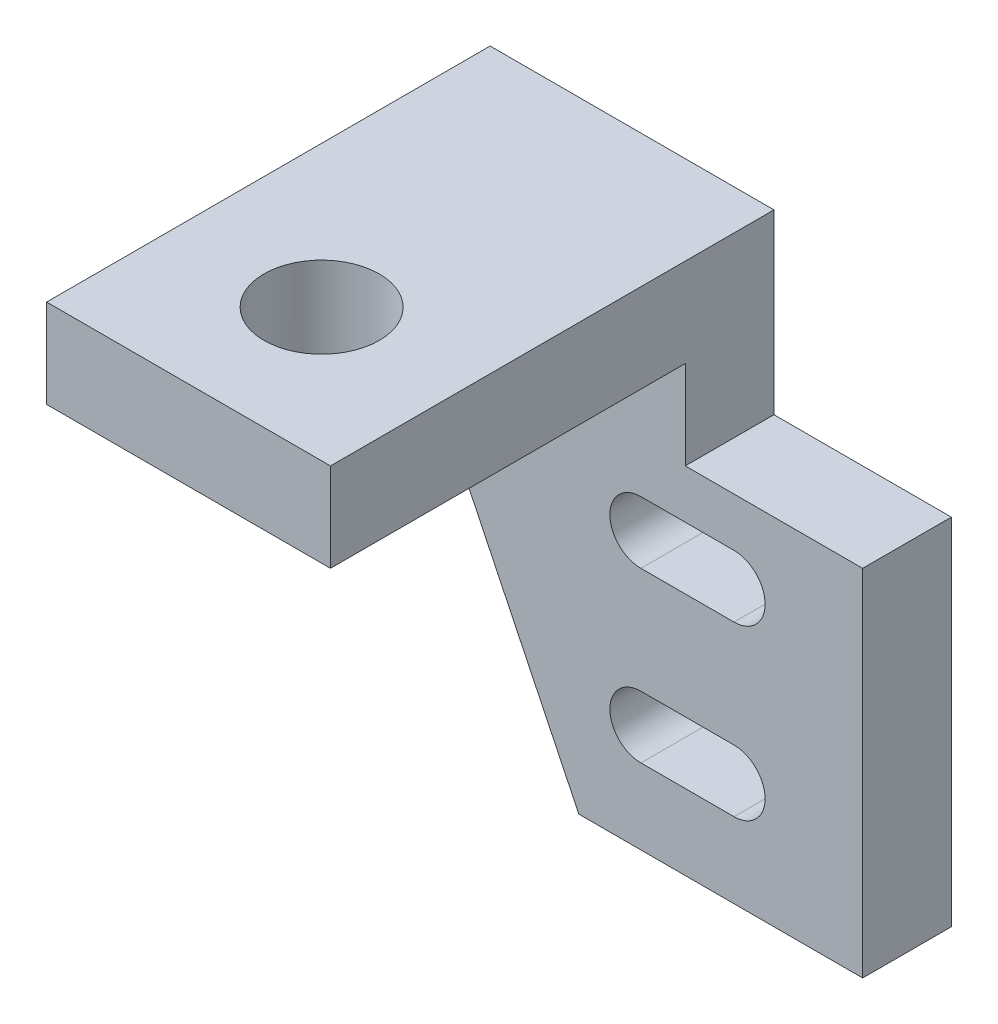
ISO-10303-21;
HEADER;
FILE_DESCRIPTION(('STEP AP214'),'2;1');
FILE_NAME('part.step','',(''),(''),'','','');
FILE_SCHEMA(('AUTOMOTIVE_DESIGN { 1 0 10303 214 1 1 1 1 }'));
ENDSEC;
DATA;
#1=APPLICATION_CONTEXT('core data for automotive mechanical design processes');
#2=APPLICATION_PROTOCOL_DEFINITION('international standard','automotive_design',2000,#1);
#3=PRODUCT_CONTEXT('',#1,'mechanical');
#4=PRODUCT('Part','Part','',(#3));
#5=PRODUCT_RELATED_PRODUCT_CATEGORY('part','',(#4));
#6=PRODUCT_DEFINITION_FORMATION('','',#4);
#7=PRODUCT_DEFINITION_CONTEXT('part definition',#1,'design');
#8=PRODUCT_DEFINITION('design','',#6,#7);
#9=PRODUCT_DEFINITION_SHAPE('','',#8);
#10=(LENGTH_UNIT() NAMED_UNIT(*) SI_UNIT(.MILLI.,.METRE.));
#11=(NAMED_UNIT(*) PLANE_ANGLE_UNIT() SI_UNIT($,.RADIAN.));
#12=(NAMED_UNIT(*) SI_UNIT($,.STERADIAN.) SOLID_ANGLE_UNIT());
#13=UNCERTAINTY_MEASURE_WITH_UNIT(LENGTH_MEASURE(1.E-05),#10,'distance_accuracy_value','');
#14=(GEOMETRIC_REPRESENTATION_CONTEXT(3) GLOBAL_UNCERTAINTY_ASSIGNED_CONTEXT((#13)) GLOBAL_UNIT_ASSIGNED_CONTEXT((#10,
#11,#12)) REPRESENTATION_CONTEXT('',''));
#15=CARTESIAN_POINT('',(0.,0.,0.));
#16=DIRECTION('',(0.,0.,1.));
#17=DIRECTION('',(1.,0.,0.));
#18=AXIS2_PLACEMENT_3D('',#15,#16,#17);
#19=CARTESIAN_POINT('',(0.,0.,5.));
#20=DIRECTION('',(0.,0.,-1.));
#21=DIRECTION('',(-1.,0.,0.));
#22=AXIS2_PLACEMENT_3D('',#19,#20,#21);
#23=PLANE('',#22);
#24=CARTESIAN_POINT('',(2.75,-14.5,5.));
#25=DIRECTION('',(0.,0.,1.));
#26=DIRECTION('',(1.,0.,0.));
#27=AXIS2_PLACEMENT_3D('',#24,#25,#26);
#28=CIRCLE('',#27,1.75);
#29=CARTESIAN_POINT('',(2.75,-16.25,5.));
#30=VERTEX_POINT('',#29);
#31=CARTESIAN_POINT('',(2.75,-12.75,5.));
#32=VERTEX_POINT('',#31);
#33=EDGE_CURVE('E191',#30,#32,#28,.T.);
#34=ORIENTED_EDGE('',*,*,#33,.F.);
#35=DIRECTION('',(1.,0.,0.));
#36=VECTOR('',#35,1.);
#37=CARTESIAN_POINT('',(2.75,-16.25,5.));
#38=LINE('',#37,#36);
#39=CARTESIAN_POINT('',(-2.49999999999999,-16.25,5.));
#40=VERTEX_POINT('',#39);
#41=EDGE_CURVE('E211',#40,#30,#38,.T.);
#42=ORIENTED_EDGE('',*,*,#41,.F.);
#43=CARTESIAN_POINT('',(-2.49999999999999,-14.5,5.));
#44=DIRECTION('',(0.,0.,1.));
#45=DIRECTION('',(1.,0.,0.));
#46=AXIS2_PLACEMENT_3D('',#43,#44,#45);
#47=CIRCLE('',#46,1.75);
#48=CARTESIAN_POINT('',(-2.49999999999999,-12.75,5.));
#49=VERTEX_POINT('',#48);
#50=EDGE_CURVE('E525',#49,#40,#47,.T.);
#51=ORIENTED_EDGE('',*,*,#50,.F.);
#52=DIRECTION('',(-1.,0.,0.));
#53=VECTOR('',#52,1.);
#54=CARTESIAN_POINT('',(2.75,-12.75,5.));
#55=LINE('',#54,#53);
#56=EDGE_CURVE('E524',#32,#49,#55,.T.);
#57=ORIENTED_EDGE('',*,*,#56,.F.);
#58=EDGE_LOOP('',(#34,#42,#51,#57));
#59=FACE_BOUND('',#58,.T.);
#60=CARTESIAN_POINT('',(2.75,-24.,5.));
#61=DIRECTION('',(0.,0.,1.));
#62=DIRECTION('',(1.,0.,0.));
#63=AXIS2_PLACEMENT_3D('',#60,#61,#62);
#64=CIRCLE('',#63,1.75);
#65=CARTESIAN_POINT('',(2.75,-25.75,5.));
#66=VERTEX_POINT('',#65);
#67=CARTESIAN_POINT('',(2.75,-22.25,5.));
#68=VERTEX_POINT('',#67);
#69=EDGE_CURVE('E228',#66,#68,#64,.T.);
#70=ORIENTED_EDGE('',*,*,#69,.F.);
#71=DIRECTION('',(1.,0.,0.));
#72=VECTOR('',#71,1.);
#73=CARTESIAN_POINT('',(2.75,-25.75,5.));
#74=LINE('',#73,#72);
#75=CARTESIAN_POINT('',(-2.49999999999999,-25.75,5.));
#76=VERTEX_POINT('',#75);
#77=EDGE_CURVE('E236',#76,#66,#74,.T.);
#78=ORIENTED_EDGE('',*,*,#77,.F.);
#79=CARTESIAN_POINT('',(-2.49999999999999,-24.,5.));
#80=DIRECTION('',(0.,0.,1.));
#81=DIRECTION('',(1.,0.,0.));
#82=AXIS2_PLACEMENT_3D('',#79,#80,#81);
#83=CIRCLE('',#82,1.75);
#84=CARTESIAN_POINT('',(-2.49999999999999,-22.25,5.));
#85=VERTEX_POINT('',#84);
#86=EDGE_CURVE('E233',#85,#76,#83,.T.);
#87=ORIENTED_EDGE('',*,*,#86,.F.);
#88=DIRECTION('',(-1.,0.,0.));
#89=VECTOR('',#88,1.);
#90=CARTESIAN_POINT('',(2.75,-22.25,5.));
#91=LINE('',#90,#89);
#92=EDGE_CURVE('E230',#68,#85,#91,.T.);
#93=ORIENTED_EDGE('',*,*,#92,.F.);
#94=EDGE_LOOP('',(#70,#78,#87,#93));
#95=FACE_BOUND('',#94,.T.);
#96=DIRECTION('',(1.,0.,0.));
#97=VECTOR('',#96,1.);
#98=CARTESIAN_POINT('',(-16.,-5.,5.));
#99=LINE('',#98,#97);
#100=CARTESIAN_POINT('',(-16.,-5.,5.));
#101=VERTEX_POINT('',#100);
#102=CARTESIAN_POINT('',(0.,-5.,5.));
#103=VERTEX_POINT('',#102);
#104=EDGE_CURVE('E50',#101,#103,#99,.T.);
#105=ORIENTED_EDGE('',*,*,#104,.F.);
#106=DIRECTION('',(0.,-1.,0.));
#107=VECTOR('',#106,1.);
#108=CARTESIAN_POINT('',(-16.,-9.29520131554418,5.));
#109=LINE('',#108,#107);
#110=CARTESIAN_POINT('',(-16.,-9.29520131554418,5.));
#111=VERTEX_POINT('',#110);
#112=EDGE_CURVE('E263',#101,#111,#109,.T.);
#113=ORIENTED_EDGE('',*,*,#112,.T.);
#114=DIRECTION('',(0.43491059789037,-0.900473637505641,0.));
#115=VECTOR('',#114,1.);
#116=CARTESIAN_POINT('',(-5.99999999999999,-30.,5.));
#117=LINE('',#116,#115);
#118=CARTESIAN_POINT('',(-5.99999999999999,-30.,5.));
#119=VERTEX_POINT('',#118);
#120=EDGE_CURVE('E261',#111,#119,#117,.T.);
#121=ORIENTED_EDGE('',*,*,#120,.T.);
#122=DIRECTION('',(1.,0.,0.));
#123=VECTOR('',#122,1.);
#124=CARTESIAN_POINT('',(10.,-30.,5.));
#125=LINE('',#124,#123);
#126=CARTESIAN_POINT('',(10.,-30.,5.));
#127=VERTEX_POINT('',#126);
#128=EDGE_CURVE('E293',#119,#127,#125,.T.);
#129=ORIENTED_EDGE('',*,*,#128,.T.);
#130=DIRECTION('',(0.,1.,0.));
#131=VECTOR('',#130,1.);
#132=CARTESIAN_POINT('',(10.,-9.99999999999999,5.));
#133=LINE('',#132,#131);
#134=CARTESIAN_POINT('',(10.,-9.99999999999999,5.));
#135=VERTEX_POINT('',#134);
#136=EDGE_CURVE('E292',#127,#135,#133,.T.);
#137=ORIENTED_EDGE('',*,*,#136,.T.);
#138=DIRECTION('',(-1.,0.,0.));
#139=VECTOR('',#138,1.);
#140=CARTESIAN_POINT('',(0.,-9.99999999999999,5.));
#141=LINE('',#140,#139);
#142=CARTESIAN_POINT('',(0.,-9.99999999999999,5.));
#143=VERTEX_POINT('',#142);
#144=EDGE_CURVE('E290',#135,#143,#141,.T.);
#145=ORIENTED_EDGE('',*,*,#144,.T.);
#146=DIRECTION('',(0.,1.,0.));
#147=VECTOR('',#146,1.);
#148=CARTESIAN_POINT('',(0.,0.,5.));
#149=LINE('',#148,#147);
#150=EDGE_CURVE('E166',#143,#103,#149,.T.);
#151=ORIENTED_EDGE('',*,*,#150,.T.);
#152=EDGE_LOOP('',(#105,#113,#121,#129,#137,#145,#151));
#153=FACE_BOUND('',#152,.T.);
#154=ADVANCED_FACE('F33',(#59,#95,#153),#23,.F.);
#155=CARTESIAN_POINT('',(0.,0.,0.));
#156=DIRECTION('',(0.,0.,-1.));
#157=DIRECTION('',(-1.,0.,0.));
#158=AXIS2_PLACEMENT_3D('',#155,#156,#157);
#159=PLANE('',#158);
#160=DIRECTION('',(1.,0.,0.));
#161=VECTOR('',#160,1.);
#162=CARTESIAN_POINT('',(2.75,-25.75,0.));
#163=LINE('',#162,#161);
#164=CARTESIAN_POINT('',(-2.49999999999999,-25.75,0.));
#165=VERTEX_POINT('',#164);
#166=CARTESIAN_POINT('',(2.75,-25.75,0.));
#167=VERTEX_POINT('',#166);
#168=EDGE_CURVE('E231',#165,#167,#163,.T.);
#169=ORIENTED_EDGE('',*,*,#168,.T.);
#170=CARTESIAN_POINT('',(2.75,-24.,0.));
#171=DIRECTION('',(0.,0.,1.));
#172=DIRECTION('',(1.,0.,0.));
#173=AXIS2_PLACEMENT_3D('',#170,#171,#172);
#174=CIRCLE('',#173,1.75);
#175=CARTESIAN_POINT('',(2.75,-22.25,0.));
#176=VERTEX_POINT('',#175);
#177=EDGE_CURVE('E227',#167,#176,#174,.T.);
#178=ORIENTED_EDGE('',*,*,#177,.T.);
#179=DIRECTION('',(-1.,0.,0.));
#180=VECTOR('',#179,1.);
#181=CARTESIAN_POINT('',(2.75,-22.25,0.));
#182=LINE('',#181,#180);
#183=CARTESIAN_POINT('',(-2.49999999999999,-22.25,0.));
#184=VERTEX_POINT('',#183);
#185=EDGE_CURVE('E241',#176,#184,#182,.T.);
#186=ORIENTED_EDGE('',*,*,#185,.T.);
#187=CARTESIAN_POINT('',(-2.49999999999999,-24.,0.));
#188=DIRECTION('',(0.,0.,1.));
#189=DIRECTION('',(1.,0.,0.));
#190=AXIS2_PLACEMENT_3D('',#187,#188,#189);
#191=CIRCLE('',#190,1.75);
#192=EDGE_CURVE('E244',#184,#165,#191,.T.);
#193=ORIENTED_EDGE('',*,*,#192,.T.);
#194=EDGE_LOOP('',(#169,#178,#186,#193));
#195=FACE_BOUND('',#194,.T.);
#196=DIRECTION('',(0.,-1.,0.));
#197=VECTOR('',#196,1.);
#198=CARTESIAN_POINT('',(-16.,-9.29520131554418,0.));
#199=LINE('',#198,#197);
#200=CARTESIAN_POINT('',(-16.,0.,0.));
#201=VERTEX_POINT('',#200);
#202=CARTESIAN_POINT('',(-16.,-9.29520131554418,0.));
#203=VERTEX_POINT('',#202);
#204=EDGE_CURVE('E258',#201,#203,#199,.T.);
#205=ORIENTED_EDGE('',*,*,#204,.F.);
#206=DIRECTION('',(-1.,0.,0.));
#207=VECTOR('',#206,1.);
#208=CARTESIAN_POINT('',(-16.,0.,0.));
#209=LINE('',#208,#207);
#210=CARTESIAN_POINT('',(0.,0.,0.));
#211=VERTEX_POINT('',#210);
#212=EDGE_CURVE('E161',#211,#201,#209,.T.);
#213=ORIENTED_EDGE('',*,*,#212,.F.);
#214=DIRECTION('',(0.,1.,0.));
#215=VECTOR('',#214,1.);
#216=CARTESIAN_POINT('',(0.,0.,0.));
#217=LINE('',#216,#215);
#218=CARTESIAN_POINT('',(0.,-9.99999999999999,0.));
#219=VERTEX_POINT('',#218);
#220=EDGE_CURVE('E278',#219,#211,#217,.T.);
#221=ORIENTED_EDGE('',*,*,#220,.F.);
#222=DIRECTION('',(-1.,0.,0.));
#223=VECTOR('',#222,1.);
#224=CARTESIAN_POINT('',(0.,-9.99999999999999,0.));
#225=LINE('',#224,#223);
#226=CARTESIAN_POINT('',(10.,-9.99999999999999,0.));
#227=VERTEX_POINT('',#226);
#228=EDGE_CURVE('E280',#227,#219,#225,.T.);
#229=ORIENTED_EDGE('',*,*,#228,.F.);
#230=DIRECTION('',(0.,1.,0.));
#231=VECTOR('',#230,1.);
#232=CARTESIAN_POINT('',(10.,-9.99999999999999,0.));
#233=LINE('',#232,#231);
#234=CARTESIAN_POINT('',(10.,-30.,0.));
#235=VERTEX_POINT('',#234);
#236=EDGE_CURVE('E282',#235,#227,#233,.T.);
#237=ORIENTED_EDGE('',*,*,#236,.F.);
#238=DIRECTION('',(1.,0.,0.));
#239=VECTOR('',#238,1.);
#240=CARTESIAN_POINT('',(10.,-30.,0.));
#241=LINE('',#240,#239);
#242=CARTESIAN_POINT('',(-5.99999999999999,-30.,0.));
#243=VERTEX_POINT('',#242);
#244=EDGE_CURVE('E284',#243,#235,#241,.T.);
#245=ORIENTED_EDGE('',*,*,#244,.F.);
#246=DIRECTION('',(0.43491059789037,-0.900473637505641,0.));
#247=VECTOR('',#246,1.);
#248=CARTESIAN_POINT('',(-5.99999999999999,-30.,0.));
#249=LINE('',#248,#247);
#250=EDGE_CURVE('E286',#203,#243,#249,.T.);
#251=ORIENTED_EDGE('',*,*,#250,.F.);
#252=EDGE_LOOP('',(#205,#213,#221,#229,#237,#245,#251));
#253=FACE_BOUND('',#252,.T.);
#254=DIRECTION('',(1.,0.,0.));
#255=VECTOR('',#254,1.);
#256=CARTESIAN_POINT('',(2.75,-16.25,0.));
#257=LINE('',#256,#255);
#258=CARTESIAN_POINT('',(-2.49999999999999,-16.25,0.));
#259=VERTEX_POINT('',#258);
#260=CARTESIAN_POINT('',(2.75,-16.25,0.));
#261=VERTEX_POINT('',#260);
#262=EDGE_CURVE('E216',#259,#261,#257,.T.);
#263=ORIENTED_EDGE('',*,*,#262,.T.);
#264=CARTESIAN_POINT('',(2.75,-14.5,0.));
#265=DIRECTION('',(0.,0.,1.));
#266=DIRECTION('',(1.,0.,0.));
#267=AXIS2_PLACEMENT_3D('',#264,#265,#266);
#268=CIRCLE('',#267,1.75);
#269=CARTESIAN_POINT('',(2.75,-12.75,0.));
#270=VERTEX_POINT('',#269);
#271=EDGE_CURVE('E200',#261,#270,#268,.T.);
#272=ORIENTED_EDGE('',*,*,#271,.T.);
#273=DIRECTION('',(-1.,0.,0.));
#274=VECTOR('',#273,1.);
#275=CARTESIAN_POINT('',(2.75,-12.75,0.));
#276=LINE('',#275,#274);
#277=CARTESIAN_POINT('',(-2.49999999999999,-12.75,0.));
#278=VERTEX_POINT('',#277);
#279=EDGE_CURVE('E203',#270,#278,#276,.T.);
#280=ORIENTED_EDGE('',*,*,#279,.T.);
#281=CARTESIAN_POINT('',(-2.49999999999999,-14.5,0.));
#282=DIRECTION('',(0.,0.,1.));
#283=DIRECTION('',(1.,0.,0.));
#284=AXIS2_PLACEMENT_3D('',#281,#282,#283);
#285=CIRCLE('',#284,1.75);
#286=EDGE_CURVE('E208',#278,#259,#285,.T.);
#287=ORIENTED_EDGE('',*,*,#286,.T.);
#288=EDGE_LOOP('',(#263,#272,#280,#287));
#289=FACE_BOUND('',#288,.T.);
#290=ADVANCED_FACE('F334',(#195,#253,#289),#159,.T.);
#291=CARTESIAN_POINT('',(-16.,-9.29520131554418,5.));
#292=DIRECTION('',(1.,0.,0.));
#293=DIRECTION('',(0.,0.,-1.));
#294=AXIS2_PLACEMENT_3D('',#291,#292,#293);
#295=PLANE('',#294);
#296=ORIENTED_EDGE('',*,*,#204,.T.);
#297=DIRECTION('',(0.,0.,-1.));
#298=VECTOR('',#297,1.);
#299=CARTESIAN_POINT('',(-16.,-9.29520131554418,5.));
#300=LINE('',#299,#298);
#301=EDGE_CURVE('E11',#111,#203,#300,.T.);
#302=ORIENTED_EDGE('',*,*,#301,.F.);
#303=ORIENTED_EDGE('',*,*,#112,.F.);
#304=DIRECTION('',(0.,0.,-1.));
#305=VECTOR('',#304,1.);
#306=CARTESIAN_POINT('',(-16.,-5.,25.));
#307=LINE('',#306,#305);
#308=CARTESIAN_POINT('',(-16.,-5.,25.));
#309=VERTEX_POINT('',#308);
#310=EDGE_CURVE('E171',#309,#101,#307,.T.);
#311=ORIENTED_EDGE('',*,*,#310,.F.);
#312=DIRECTION('',(0.,-1.,0.));
#313=VECTOR('',#312,1.);
#314=CARTESIAN_POINT('',(-16.,0.,25.));
#315=LINE('',#314,#313);
#316=CARTESIAN_POINT('',(-16.,0.,25.));
#317=VERTEX_POINT('',#316);
#318=EDGE_CURVE('E169',#317,#309,#315,.T.);
#319=ORIENTED_EDGE('',*,*,#318,.F.);
#320=DIRECTION('',(0.,0.,-1.));
#321=VECTOR('',#320,1.);
#322=CARTESIAN_POINT('',(-16.,0.,5.));
#323=LINE('',#322,#321);
#324=EDGE_CURVE('E154',#317,#201,#323,.T.);
#325=ORIENTED_EDGE('',*,*,#324,.T.);
#326=EDGE_LOOP('',(#296,#302,#303,#311,#319,#325));
#327=FACE_BOUND('',#326,.T.);
#328=ADVANCED_FACE('F35',(#327),#295,.F.);
#329=CARTESIAN_POINT('',(-5.99999999999999,-30.,5.));
#330=DIRECTION('',(0.900473637505641,0.43491059789037,0.));
#331=DIRECTION('',(-0.43491059789037,0.900473637505641,0.));
#332=AXIS2_PLACEMENT_3D('',#329,#330,#331);
#333=PLANE('',#332);
#334=ORIENTED_EDGE('',*,*,#250,.T.);
#335=DIRECTION('',(0.,0.,-1.));
#336=VECTOR('',#335,1.);
#337=CARTESIAN_POINT('',(-5.99999999999999,-30.,5.));
#338=LINE('',#337,#336);
#339=EDGE_CURVE('E42',#119,#243,#338,.T.);
#340=ORIENTED_EDGE('',*,*,#339,.F.);
#341=ORIENTED_EDGE('',*,*,#120,.F.);
#342=ORIENTED_EDGE('',*,*,#301,.T.);
#343=EDGE_LOOP('',(#334,#340,#341,#342));
#344=FACE_BOUND('',#343,.T.);
#345=ADVANCED_FACE('F300',(#344),#333,.F.);
#346=CARTESIAN_POINT('',(10.,-30.,5.));
#347=DIRECTION('',(0.,1.,0.));
#348=DIRECTION('',(-1.,0.,0.));
#349=AXIS2_PLACEMENT_3D('',#346,#347,#348);
#350=PLANE('',#349);
#351=ORIENTED_EDGE('',*,*,#244,.T.);
#352=DIRECTION('',(0.,0.,-1.));
#353=VECTOR('',#352,1.);
#354=CARTESIAN_POINT('',(10.,-30.,5.));
#355=LINE('',#354,#353);
#356=EDGE_CURVE('E267',#127,#235,#355,.T.);
#357=ORIENTED_EDGE('',*,*,#356,.F.);
#358=ORIENTED_EDGE('',*,*,#128,.F.);
#359=ORIENTED_EDGE('',*,*,#339,.T.);
#360=EDGE_LOOP('',(#351,#357,#358,#359));
#361=FACE_BOUND('',#360,.T.);
#362=ADVANCED_FACE('F303',(#361),#350,.F.);
#363=CARTESIAN_POINT('',(10.,-9.99999999999999,5.));
#364=DIRECTION('',(-1.,0.,0.));
#365=DIRECTION('',(0.,-1.,0.));
#366=AXIS2_PLACEMENT_3D('',#363,#364,#365);
#367=PLANE('',#366);
#368=ORIENTED_EDGE('',*,*,#236,.T.);
#369=DIRECTION('',(0.,0.,-1.));
#370=VECTOR('',#369,1.);
#371=CARTESIAN_POINT('',(10.,-9.99999999999999,5.));
#372=LINE('',#371,#370);
#373=EDGE_CURVE('E270',#135,#227,#372,.T.);
#374=ORIENTED_EDGE('',*,*,#373,.F.);
#375=ORIENTED_EDGE('',*,*,#136,.F.);
#376=ORIENTED_EDGE('',*,*,#356,.T.);
#377=EDGE_LOOP('',(#368,#374,#375,#376));
#378=FACE_BOUND('',#377,.T.);
#379=ADVANCED_FACE('F308',(#378),#367,.F.);
#380=CARTESIAN_POINT('',(0.,-9.99999999999999,5.));
#381=DIRECTION('',(0.,-1.,0.));
#382=DIRECTION('',(0.,0.,-1.));
#383=AXIS2_PLACEMENT_3D('',#380,#381,#382);
#384=PLANE('',#383);
#385=ORIENTED_EDGE('',*,*,#228,.T.);
#386=DIRECTION('',(0.,0.,-1.));
#387=VECTOR('',#386,1.);
#388=CARTESIAN_POINT('',(0.,-9.99999999999999,5.));
#389=LINE('',#388,#387);
#390=EDGE_CURVE('E273',#143,#219,#389,.T.);
#391=ORIENTED_EDGE('',*,*,#390,.F.);
#392=ORIENTED_EDGE('',*,*,#144,.F.);
#393=ORIENTED_EDGE('',*,*,#373,.T.);
#394=EDGE_LOOP('',(#385,#391,#392,#393));
#395=FACE_BOUND('',#394,.T.);
#396=ADVANCED_FACE('F313',(#395),#384,.F.);
#397=CARTESIAN_POINT('',(0.,0.,5.));
#398=DIRECTION('',(-1.,0.,0.));
#399=DIRECTION('',(0.,0.,1.));
#400=AXIS2_PLACEMENT_3D('',#397,#398,#399);
#401=PLANE('',#400);
#402=ORIENTED_EDGE('',*,*,#220,.T.);
#403=DIRECTION('',(0.,0.,-1.));
#404=VECTOR('',#403,1.);
#405=CARTESIAN_POINT('',(0.,0.,5.));
#406=LINE('',#405,#404);
#407=CARTESIAN_POINT('',(0.,0.,25.));
#408=VERTEX_POINT('',#407);
#409=EDGE_CURVE('E165',#408,#211,#406,.T.);
#410=ORIENTED_EDGE('',*,*,#409,.F.);
#411=DIRECTION('',(0.,1.,0.));
#412=VECTOR('',#411,1.);
#413=CARTESIAN_POINT('',(0.,-5.,25.));
#414=LINE('',#413,#412);
#415=CARTESIAN_POINT('',(0.,-5.,25.));
#416=VERTEX_POINT('',#415);
#417=EDGE_CURVE('E179',#416,#408,#414,.T.);
#418=ORIENTED_EDGE('',*,*,#417,.F.);
#419=DIRECTION('',(0.,0.,-1.));
#420=VECTOR('',#419,1.);
#421=CARTESIAN_POINT('',(0.,-5.,25.));
#422=LINE('',#421,#420);
#423=EDGE_CURVE('E188',#416,#103,#422,.T.);
#424=ORIENTED_EDGE('',*,*,#423,.T.);
#425=ORIENTED_EDGE('',*,*,#150,.F.);
#426=ORIENTED_EDGE('',*,*,#390,.T.);
#427=EDGE_LOOP('',(#402,#410,#418,#424,#425,#426));
#428=FACE_BOUND('',#427,.T.);
#429=ADVANCED_FACE('F317',(#428),#401,.F.);
#430=CARTESIAN_POINT('',(-16.,0.,5.));
#431=DIRECTION('',(0.,-1.,0.));
#432=DIRECTION('',(0.,0.,-1.));
#433=AXIS2_PLACEMENT_3D('',#430,#431,#432);
#434=PLANE('',#433);
#435=CARTESIAN_POINT('',(-8.,0.,17.5));
#436=DIRECTION('',(0.,-1.,0.));
#437=DIRECTION('',(0.,0.,-1.));
#438=AXIS2_PLACEMENT_3D('',#435,#436,#437);
#439=CIRCLE('',#438,3.25);
#440=CARTESIAN_POINT('',(-8.,0.,14.25));
#441=VERTEX_POINT('',#440);
#442=EDGE_CURVE('E181',#441,#441,#439,.F.);
#443=ORIENTED_EDGE('',*,*,#442,.F.);
#444=EDGE_LOOP('',(#443));
#445=FACE_BOUND('',#444,.T.);
#446=ORIENTED_EDGE('',*,*,#212,.T.);
#447=ORIENTED_EDGE('',*,*,#324,.F.);
#448=DIRECTION('',(-1.,0.,0.));
#449=VECTOR('',#448,1.);
#450=CARTESIAN_POINT('',(0.,0.,25.));
#451=LINE('',#450,#449);
#452=EDGE_CURVE('E159',#408,#317,#451,.T.);
#453=ORIENTED_EDGE('',*,*,#452,.F.);
#454=ORIENTED_EDGE('',*,*,#409,.T.);
#455=EDGE_LOOP('',(#446,#447,#453,#454));
#456=FACE_BOUND('',#455,.T.);
#457=ADVANCED_FACE('F156',(#445,#456),#434,.F.);
#458=CARTESIAN_POINT('',(2.75,-24.,5.));
#459=DIRECTION('',(0.,0.,-1.));
#460=DIRECTION('',(-1.,0.,0.));
#461=AXIS2_PLACEMENT_3D('',#458,#459,#460);
#462=CYLINDRICAL_SURFACE('',#461,1.75);
#463=ORIENTED_EDGE('',*,*,#177,.F.);
#464=DIRECTION('',(0.,0.,-1.));
#465=VECTOR('',#464,1.);
#466=CARTESIAN_POINT('',(2.75,-25.75,5.));
#467=LINE('',#466,#465);
#468=EDGE_CURVE('E238',#66,#167,#467,.T.);
#469=ORIENTED_EDGE('',*,*,#468,.F.);
#470=ORIENTED_EDGE('',*,*,#69,.T.);
#471=DIRECTION('',(0.,0.,-1.));
#472=VECTOR('',#471,1.);
#473=CARTESIAN_POINT('',(2.75,-22.25,5.));
#474=LINE('',#473,#472);
#475=EDGE_CURVE('E255',#68,#176,#474,.T.);
#476=ORIENTED_EDGE('',*,*,#475,.T.);
#477=EDGE_LOOP('',(#463,#469,#470,#476));
#478=FACE_BOUND('',#477,.T.);
#479=ADVANCED_FACE('F345',(#478),#462,.F.);
#480=CARTESIAN_POINT('',(2.75,-22.25,5.));
#481=DIRECTION('',(0.,-1.,0.));
#482=DIRECTION('',(0.,0.,-1.));
#483=AXIS2_PLACEMENT_3D('',#480,#481,#482);
#484=PLANE('',#483);
#485=ORIENTED_EDGE('',*,*,#185,.F.);
#486=ORIENTED_EDGE('',*,*,#475,.F.);
#487=ORIENTED_EDGE('',*,*,#92,.T.);
#488=DIRECTION('',(0.,0.,-1.));
#489=VECTOR('',#488,1.);
#490=CARTESIAN_POINT('',(-2.49999999999999,-22.25,5.));
#491=LINE('',#490,#489);
#492=EDGE_CURVE('E253',#85,#184,#491,.T.);
#493=ORIENTED_EDGE('',*,*,#492,.T.);
#494=EDGE_LOOP('',(#485,#486,#487,#493));
#495=FACE_BOUND('',#494,.T.);
#496=ADVANCED_FACE('F402',(#495),#484,.T.);
#497=CARTESIAN_POINT('',(-2.49999999999999,-24.,5.));
#498=DIRECTION('',(0.,0.,-1.));
#499=DIRECTION('',(-1.,0.,0.));
#500=AXIS2_PLACEMENT_3D('',#497,#498,#499);
#501=CYLINDRICAL_SURFACE('',#500,1.75);
#502=ORIENTED_EDGE('',*,*,#192,.F.);
#503=ORIENTED_EDGE('',*,*,#492,.F.);
#504=ORIENTED_EDGE('',*,*,#86,.T.);
#505=DIRECTION('',(0.,0.,-1.));
#506=VECTOR('',#505,1.);
#507=CARTESIAN_POINT('',(-2.49999999999999,-25.75,5.));
#508=LINE('',#507,#506);
#509=EDGE_CURVE('E251',#76,#165,#508,.T.);
#510=ORIENTED_EDGE('',*,*,#509,.T.);
#511=EDGE_LOOP('',(#502,#503,#504,#510));
#512=FACE_BOUND('',#511,.T.);
#513=ADVANCED_FACE('F412',(#512),#501,.F.);
#514=CARTESIAN_POINT('',(2.75,-25.75,5.));
#515=DIRECTION('',(0.,1.,0.));
#516=DIRECTION('',(0.,0.,1.));
#517=AXIS2_PLACEMENT_3D('',#514,#515,#516);
#518=PLANE('',#517);
#519=ORIENTED_EDGE('',*,*,#168,.F.);
#520=ORIENTED_EDGE('',*,*,#509,.F.);
#521=ORIENTED_EDGE('',*,*,#77,.T.);
#522=ORIENTED_EDGE('',*,*,#468,.T.);
#523=EDGE_LOOP('',(#519,#520,#521,#522));
#524=FACE_BOUND('',#523,.T.);
#525=ADVANCED_FACE('F421',(#524),#518,.T.);
#526=CARTESIAN_POINT('',(2.75,-14.5,5.));
#527=DIRECTION('',(0.,0.,-1.));
#528=DIRECTION('',(-1.,0.,0.));
#529=AXIS2_PLACEMENT_3D('',#526,#527,#528);
#530=CYLINDRICAL_SURFACE('',#529,1.75);
#531=ORIENTED_EDGE('',*,*,#271,.F.);
#532=DIRECTION('',(0.,0.,-1.));
#533=VECTOR('',#532,1.);
#534=CARTESIAN_POINT('',(2.75,-16.25,5.));
#535=LINE('',#534,#533);
#536=EDGE_CURVE('E218',#30,#261,#535,.T.);
#537=ORIENTED_EDGE('',*,*,#536,.F.);
#538=ORIENTED_EDGE('',*,*,#33,.T.);
#539=DIRECTION('',(0.,0.,-1.));
#540=VECTOR('',#539,1.);
#541=CARTESIAN_POINT('',(2.75,-12.75,5.));
#542=LINE('',#541,#540);
#543=EDGE_CURVE('E224',#32,#270,#542,.T.);
#544=ORIENTED_EDGE('',*,*,#543,.T.);
#545=EDGE_LOOP('',(#531,#537,#538,#544));
#546=FACE_BOUND('',#545,.T.);
#547=ADVANCED_FACE('F431',(#546),#530,.F.);
#548=CARTESIAN_POINT('',(2.75,-12.75,5.));
#549=DIRECTION('',(0.,-1.,0.));
#550=DIRECTION('',(1.,0.,0.));
#551=AXIS2_PLACEMENT_3D('',#548,#549,#550);
#552=PLANE('',#551);
#553=ORIENTED_EDGE('',*,*,#279,.F.);
#554=ORIENTED_EDGE('',*,*,#543,.F.);
#555=ORIENTED_EDGE('',*,*,#56,.T.);
#556=DIRECTION('',(0.,0.,-1.));
#557=VECTOR('',#556,1.);
#558=CARTESIAN_POINT('',(-2.49999999999999,-12.75,5.));
#559=LINE('',#558,#557);
#560=EDGE_CURVE('E222',#49,#278,#559,.T.);
#561=ORIENTED_EDGE('',*,*,#560,.T.);
#562=EDGE_LOOP('',(#553,#554,#555,#561));
#563=FACE_BOUND('',#562,.T.);
#564=ADVANCED_FACE('F441',(#563),#552,.T.);
#565=CARTESIAN_POINT('',(-2.49999999999999,-14.5,5.));
#566=DIRECTION('',(0.,0.,-1.));
#567=DIRECTION('',(-1.,0.,0.));
#568=AXIS2_PLACEMENT_3D('',#565,#566,#567);
#569=CYLINDRICAL_SURFACE('',#568,1.75);
#570=ORIENTED_EDGE('',*,*,#286,.F.);
#571=ORIENTED_EDGE('',*,*,#560,.F.);
#572=ORIENTED_EDGE('',*,*,#50,.T.);
#573=DIRECTION('',(0.,0.,-1.));
#574=VECTOR('',#573,1.);
#575=CARTESIAN_POINT('',(-2.49999999999999,-16.25,5.));
#576=LINE('',#575,#574);
#577=EDGE_CURVE('E58',#40,#259,#576,.T.);
#578=ORIENTED_EDGE('',*,*,#577,.T.);
#579=EDGE_LOOP('',(#570,#571,#572,#578));
#580=FACE_BOUND('',#579,.T.);
#581=ADVANCED_FACE('F330',(#580),#569,.F.);
#582=CARTESIAN_POINT('',(2.75,-16.25,5.));
#583=DIRECTION('',(0.,1.,0.));
#584=DIRECTION('',(-1.,0.,0.));
#585=AXIS2_PLACEMENT_3D('',#582,#583,#584);
#586=PLANE('',#585);
#587=ORIENTED_EDGE('',*,*,#262,.F.);
#588=ORIENTED_EDGE('',*,*,#577,.F.);
#589=ORIENTED_EDGE('',*,*,#41,.T.);
#590=ORIENTED_EDGE('',*,*,#536,.T.);
#591=EDGE_LOOP('',(#587,#588,#589,#590));
#592=FACE_BOUND('',#591,.T.);
#593=ADVANCED_FACE('F321',(#592),#586,.T.);
#594=CARTESIAN_POINT('',(-16.,-5.,25.));
#595=DIRECTION('',(0.,1.,0.));
#596=DIRECTION('',(-1.,0.,0.));
#597=AXIS2_PLACEMENT_3D('',#594,#595,#596);
#598=PLANE('',#597);
#599=CARTESIAN_POINT('',(-8.,-5.,17.5));
#600=DIRECTION('',(0.,-1.,0.));
#601=DIRECTION('',(1.,0.,0.));
#602=AXIS2_PLACEMENT_3D('',#599,#600,#601);
#603=CIRCLE('',#602,3.25);
#604=CARTESIAN_POINT('',(-4.75,-5.,17.5));
#605=VERTEX_POINT('',#604);
#606=EDGE_CURVE('E512',#605,#605,#603,.T.);
#607=ORIENTED_EDGE('',*,*,#606,.F.);
#608=EDGE_LOOP('',(#607));
#609=FACE_BOUND('',#608,.T.);
#610=ORIENTED_EDGE('',*,*,#104,.T.);
#611=ORIENTED_EDGE('',*,*,#423,.F.);
#612=DIRECTION('',(1.,0.,0.));
#613=VECTOR('',#612,1.);
#614=CARTESIAN_POINT('',(-16.,-5.,25.));
#615=LINE('',#614,#613);
#616=EDGE_CURVE('E174',#309,#416,#615,.T.);
#617=ORIENTED_EDGE('',*,*,#616,.F.);
#618=ORIENTED_EDGE('',*,*,#310,.T.);
#619=EDGE_LOOP('',(#610,#611,#617,#618));
#620=FACE_BOUND('',#619,.T.);
#621=ADVANCED_FACE('F319',(#609,#620),#598,.F.);
#622=CARTESIAN_POINT('',(0.,0.,25.));
#623=DIRECTION('',(0.,0.,1.));
#624=DIRECTION('',(1.,0.,0.));
#625=AXIS2_PLACEMENT_3D('',#622,#623,#624);
#626=PLANE('',#625);
#627=ORIENTED_EDGE('',*,*,#452,.T.);
#628=ORIENTED_EDGE('',*,*,#318,.T.);
#629=ORIENTED_EDGE('',*,*,#616,.T.);
#630=ORIENTED_EDGE('',*,*,#417,.T.);
#631=EDGE_LOOP('',(#627,#628,#629,#630));
#632=FACE_BOUND('',#631,.T.);
#633=ADVANCED_FACE('F177',(#632),#626,.T.);
#634=CARTESIAN_POINT('',(-8.,0.001000000000001,17.5));
#635=DIRECTION('',(0.,-1.,0.));
#636=DIRECTION('',(1.,0.,0.));
#637=AXIS2_PLACEMENT_3D('',#634,#635,#636);
#638=CYLINDRICAL_SURFACE('',#637,3.25);
#639=ORIENTED_EDGE('',*,*,#606,.T.);
#640=EDGE_LOOP('',(#639));
#641=FACE_BOUND('',#640,.T.);
#642=ORIENTED_EDGE('',*,*,#442,.T.);
#643=EDGE_LOOP('',(#642));
#644=FACE_BOUND('',#643,.T.);
#645=ADVANCED_FACE('F328',(#641,#644),#638,.F.);
#646=CLOSED_SHELL('',(#154,#290,#328,#345,#362,#379,#396,#429,#457,#479,#496,#513,#525,#547,
#564,#581,#593,#621,#633,#645));
#647=MANIFOLD_SOLID_BREP('B2',#646);
#648=ADVANCED_BREP_SHAPE_REPRESENTATION('',(#18,#647),#14);
#649=SHAPE_DEFINITION_REPRESENTATION(#9,#648);
ENDSEC;
END-ISO-10303-21;
